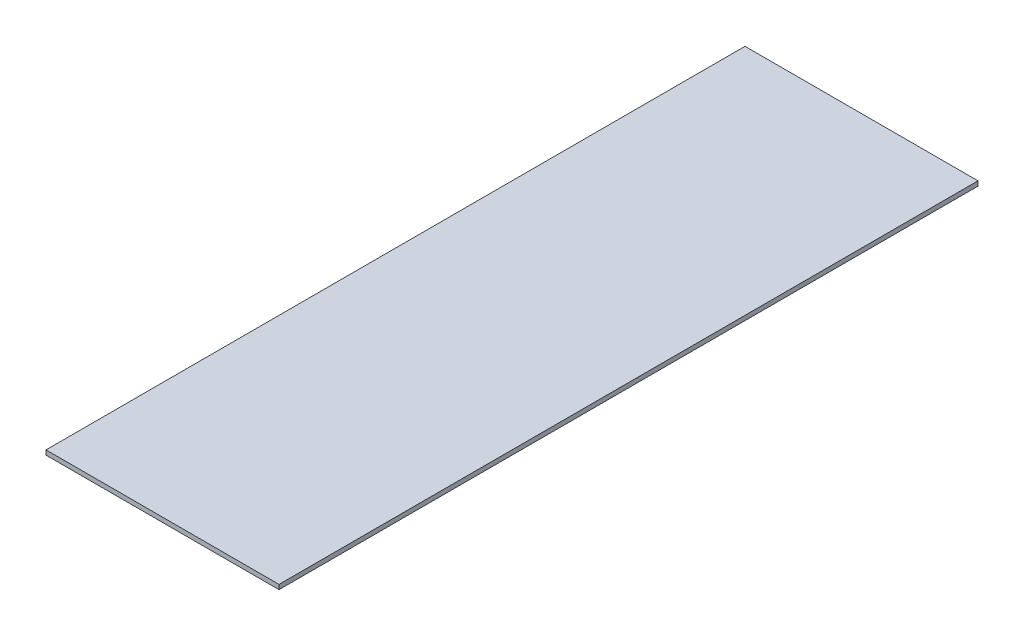
ISO-10303-21;
HEADER;
FILE_DESCRIPTION(('STEP AP214'),'2;1');
FILE_NAME('part.step','',(''),(''),'','','');
FILE_SCHEMA(('AUTOMOTIVE_DESIGN { 1 0 10303 214 1 1 1 1 }'));
ENDSEC;
DATA;
#1=APPLICATION_CONTEXT('core data for automotive mechanical design processes');
#2=APPLICATION_PROTOCOL_DEFINITION('international standard','automotive_design',2000,#1);
#3=PRODUCT_CONTEXT('',#1,'mechanical');
#4=PRODUCT('Part','Part','',(#3));
#5=PRODUCT_RELATED_PRODUCT_CATEGORY('part','',(#4));
#6=PRODUCT_DEFINITION_FORMATION('','',#4);
#7=PRODUCT_DEFINITION_CONTEXT('part definition',#1,'design');
#8=PRODUCT_DEFINITION('design','',#6,#7);
#9=PRODUCT_DEFINITION_SHAPE('','',#8);
#10=(LENGTH_UNIT() NAMED_UNIT(*) SI_UNIT(.MILLI.,.METRE.));
#11=(NAMED_UNIT(*) PLANE_ANGLE_UNIT() SI_UNIT($,.RADIAN.));
#12=(NAMED_UNIT(*) SI_UNIT($,.STERADIAN.) SOLID_ANGLE_UNIT());
#13=UNCERTAINTY_MEASURE_WITH_UNIT(LENGTH_MEASURE(1.E-05),#10,'distance_accuracy_value','');
#14=(GEOMETRIC_REPRESENTATION_CONTEXT(3) GLOBAL_UNCERTAINTY_ASSIGNED_CONTEXT((#13)) GLOBAL_UNIT_ASSIGNED_CONTEXT((#10,
#11,#12)) REPRESENTATION_CONTEXT('',''));
#15=CARTESIAN_POINT('',(0.,0.,0.));
#16=DIRECTION('',(0.,0.,1.));
#17=DIRECTION('',(1.,0.,0.));
#18=AXIS2_PLACEMENT_3D('',#15,#16,#17);
#19=CARTESIAN_POINT('',(-14.3661807580175,1.,-131.961516034985));
#20=DIRECTION('',(1.,0.,0.));
#21=DIRECTION('',(0.,0.,-1.));
#22=AXIS2_PLACEMENT_3D('',#19,#20,#21);
#23=PLANE('',#22);
#24=DIRECTION('',(0.,0.,1.));
#25=VECTOR('',#24,1.);
#26=CARTESIAN_POINT('',(-14.3661807580175,0.,-131.961516034985));
#27=LINE('',#26,#25);
#28=CARTESIAN_POINT('',(-14.3661807580175,0.,-131.961516034985));
#29=VERTEX_POINT('',#28);
#30=CARTESIAN_POINT('',(-14.3661807580175,0.,20.4384839650145));
#31=VERTEX_POINT('',#30);
#32=EDGE_CURVE('E107',#29,#31,#27,.T.);
#33=ORIENTED_EDGE('',*,*,#32,.T.);
#34=DIRECTION('',(0.,-1.,0.));
#35=VECTOR('',#34,1.);
#36=CARTESIAN_POINT('',(-14.3661807580175,1.,20.4384839650145));
#37=LINE('',#36,#35);
#38=CARTESIAN_POINT('',(-14.3661807580175,1.,20.4384839650145));
#39=VERTEX_POINT('',#38);
#40=EDGE_CURVE('E11',#39,#31,#37,.T.);
#41=ORIENTED_EDGE('',*,*,#40,.F.);
#42=DIRECTION('',(0.,0.,1.));
#43=VECTOR('',#42,1.);
#44=CARTESIAN_POINT('',(-14.3661807580175,1.,-131.961516034985));
#45=LINE('',#44,#43);
#46=CARTESIAN_POINT('',(-14.3661807580175,1.,-131.961516034985));
#47=VERTEX_POINT('',#46);
#48=EDGE_CURVE('E91',#47,#39,#45,.T.);
#49=ORIENTED_EDGE('',*,*,#48,.F.);
#50=DIRECTION('',(0.,-1.,0.));
#51=VECTOR('',#50,1.);
#52=CARTESIAN_POINT('',(-14.3661807580175,1.,-131.961516034985));
#53=LINE('',#52,#51);
#54=EDGE_CURVE('E103',#47,#29,#53,.T.);
#55=ORIENTED_EDGE('',*,*,#54,.T.);
#56=EDGE_LOOP('',(#33,#41,#49,#55));
#57=FACE_BOUND('',#56,.T.);
#58=ADVANCED_FACE('F39',(#57),#23,.F.);
#59=CARTESIAN_POINT('',(-14.3661807580175,1.,20.4384839650145));
#60=DIRECTION('',(0.,0.,-1.));
#61=DIRECTION('',(-1.,0.,0.));
#62=AXIS2_PLACEMENT_3D('',#59,#60,#61);
#63=PLANE('',#62);
#64=DIRECTION('',(1.,0.,0.));
#65=VECTOR('',#64,1.);
#66=CARTESIAN_POINT('',(-14.3661807580175,0.,20.4384839650145));
#67=LINE('',#66,#65);
#68=CARTESIAN_POINT('',(36.4338192419825,0.,20.4384839650145));
#69=VERTEX_POINT('',#68);
#70=EDGE_CURVE('E96',#31,#69,#67,.T.);
#71=ORIENTED_EDGE('',*,*,#70,.T.);
#72=DIRECTION('',(0.,-1.,0.));
#73=VECTOR('',#72,1.);
#74=CARTESIAN_POINT('',(36.4338192419825,1.,20.4384839650145));
#75=LINE('',#74,#73);
#76=CARTESIAN_POINT('',(36.4338192419825,1.,20.4384839650145));
#77=VERTEX_POINT('',#76);
#78=EDGE_CURVE('E48',#77,#69,#75,.T.);
#79=ORIENTED_EDGE('',*,*,#78,.F.);
#80=DIRECTION('',(1.,0.,0.));
#81=VECTOR('',#80,1.);
#82=CARTESIAN_POINT('',(-14.3661807580175,1.,20.4384839650145));
#83=LINE('',#82,#81);
#84=EDGE_CURVE('E86',#39,#77,#83,.T.);
#85=ORIENTED_EDGE('',*,*,#84,.F.);
#86=ORIENTED_EDGE('',*,*,#40,.T.);
#87=EDGE_LOOP('',(#71,#79,#85,#86));
#88=FACE_BOUND('',#87,.T.);
#89=ADVANCED_FACE('F95',(#88),#63,.F.);
#90=CARTESIAN_POINT('',(36.4338192419825,1.,-131.961516034985));
#91=DIRECTION('',(-1.,0.,0.));
#92=DIRECTION('',(0.,0.,1.));
#93=AXIS2_PLACEMENT_3D('',#90,#91,#92);
#94=PLANE('',#93);
#95=DIRECTION('',(0.,0.,-1.));
#96=VECTOR('',#95,1.);
#97=CARTESIAN_POINT('',(36.4338192419825,0.,-131.961516034985));
#98=LINE('',#97,#96);
#99=CARTESIAN_POINT('',(36.4338192419825,0.,-131.961516034985));
#100=VERTEX_POINT('',#99);
#101=EDGE_CURVE('E73',#69,#100,#98,.T.);
#102=ORIENTED_EDGE('',*,*,#101,.T.);
#103=DIRECTION('',(0.,-1.,0.));
#104=VECTOR('',#103,1.);
#105=CARTESIAN_POINT('',(36.4338192419825,1.,-131.961516034985));
#106=LINE('',#105,#104);
#107=CARTESIAN_POINT('',(36.4338192419825,1.,-131.961516034985));
#108=VERTEX_POINT('',#107);
#109=EDGE_CURVE('E98',#108,#100,#106,.T.);
#110=ORIENTED_EDGE('',*,*,#109,.F.);
#111=DIRECTION('',(0.,0.,-1.));
#112=VECTOR('',#111,1.);
#113=CARTESIAN_POINT('',(36.4338192419825,1.,-131.961516034985));
#114=LINE('',#113,#112);
#115=EDGE_CURVE('E89',#77,#108,#114,.T.);
#116=ORIENTED_EDGE('',*,*,#115,.F.);
#117=ORIENTED_EDGE('',*,*,#78,.T.);
#118=EDGE_LOOP('',(#102,#110,#116,#117));
#119=FACE_BOUND('',#118,.T.);
#120=ADVANCED_FACE('F99',(#119),#94,.F.);
#121=CARTESIAN_POINT('',(-14.3661807580175,1.,-131.961516034985));
#122=DIRECTION('',(0.,0.,1.));
#123=DIRECTION('',(1.,0.,0.));
#124=AXIS2_PLACEMENT_3D('',#121,#122,#123);
#125=PLANE('',#124);
#126=DIRECTION('',(-1.,0.,0.));
#127=VECTOR('',#126,1.);
#128=CARTESIAN_POINT('',(-14.3661807580175,0.,-131.961516034985));
#129=LINE('',#128,#127);
#130=EDGE_CURVE('E79',#100,#29,#129,.T.);
#131=ORIENTED_EDGE('',*,*,#130,.T.);
#132=ORIENTED_EDGE('',*,*,#54,.F.);
#133=DIRECTION('',(-1.,0.,0.));
#134=VECTOR('',#133,1.);
#135=CARTESIAN_POINT('',(-14.3661807580175,1.,-131.961516034985));
#136=LINE('',#135,#134);
#137=EDGE_CURVE('E56',#108,#47,#136,.T.);
#138=ORIENTED_EDGE('',*,*,#137,.F.);
#139=ORIENTED_EDGE('',*,*,#109,.T.);
#140=EDGE_LOOP('',(#131,#132,#138,#139));
#141=FACE_BOUND('',#140,.T.);
#142=ADVANCED_FACE('F120',(#141),#125,.F.);
#143=CARTESIAN_POINT('',(0.,1.,0.));
#144=DIRECTION('',(0.,1.,0.));
#145=DIRECTION('',(0.,0.,1.));
#146=AXIS2_PLACEMENT_3D('',#143,#144,#145);
#147=PLANE('',#146);
#148=ORIENTED_EDGE('',*,*,#48,.T.);
#149=ORIENTED_EDGE('',*,*,#84,.T.);
#150=ORIENTED_EDGE('',*,*,#115,.T.);
#151=ORIENTED_EDGE('',*,*,#137,.T.);
#152=EDGE_LOOP('',(#148,#149,#150,#151));
#153=FACE_BOUND('',#152,.T.);
#154=ADVANCED_FACE('F87',(#153),#147,.T.);
#155=CARTESIAN_POINT('',(0.,0.,0.));
#156=DIRECTION('',(0.,1.,0.));
#157=DIRECTION('',(0.,0.,1.));
#158=AXIS2_PLACEMENT_3D('',#155,#156,#157);
#159=PLANE('',#158);
#160=ORIENTED_EDGE('',*,*,#32,.F.);
#161=ORIENTED_EDGE('',*,*,#130,.F.);
#162=ORIENTED_EDGE('',*,*,#101,.F.);
#163=ORIENTED_EDGE('',*,*,#70,.F.);
#164=EDGE_LOOP('',(#160,#161,#162,#163));
#165=FACE_BOUND('',#164,.T.);
#166=ADVANCED_FACE('F123',(#165),#159,.F.);
#167=CLOSED_SHELL('',(#58,#89,#120,#142,#154,#166));
#168=MANIFOLD_SOLID_BREP('B2',#167);
#169=ADVANCED_BREP_SHAPE_REPRESENTATION('',(#18,#168),#14);
#170=SHAPE_DEFINITION_REPRESENTATION(#9,#169);
ENDSEC;
END-ISO-10303-21;
